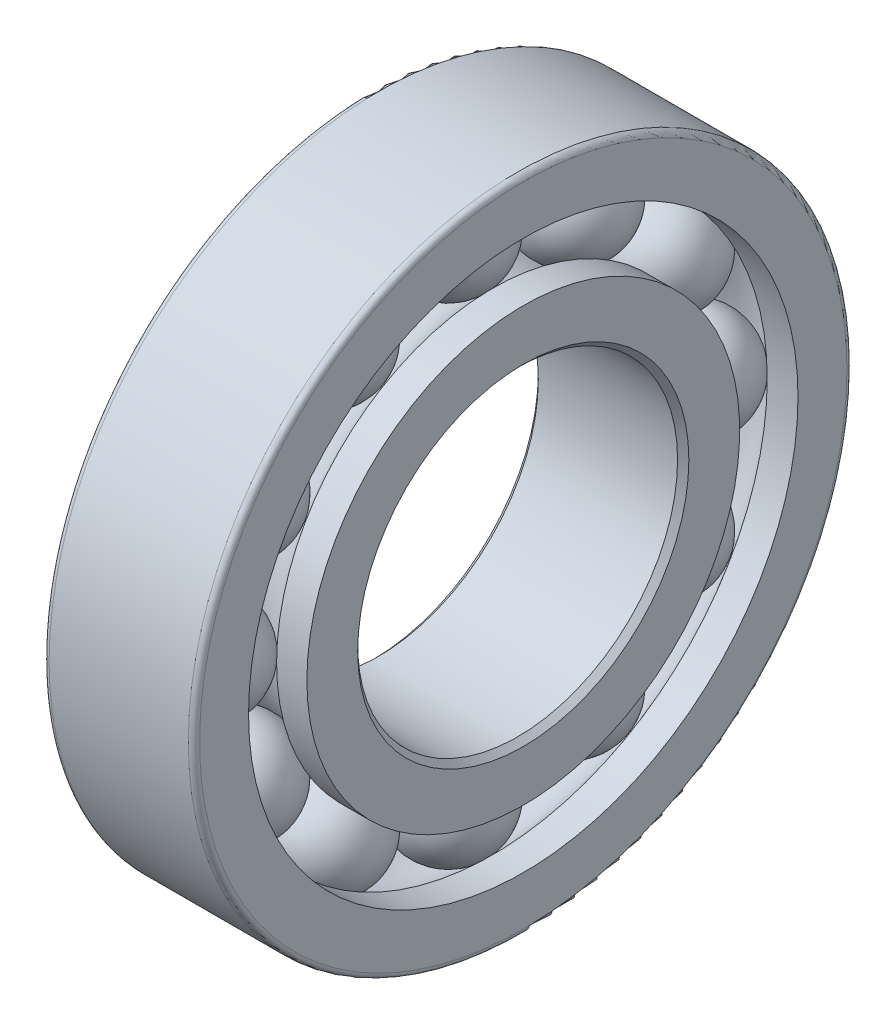
ISO-10303-21;
HEADER;
FILE_DESCRIPTION(('STEP AP214'),'2;1');
FILE_NAME('part.step','',(''),(''),'','','');
FILE_SCHEMA(('AUTOMOTIVE_DESIGN { 1 0 10303 214 1 1 1 1 }'));
ENDSEC;
DATA;
#1=APPLICATION_CONTEXT('core data for automotive mechanical design processes');
#2=APPLICATION_PROTOCOL_DEFINITION('international standard','automotive_design',2000,#1);
#3=PRODUCT_CONTEXT('',#1,'mechanical');
#4=PRODUCT('Part','Part','',(#3));
#5=PRODUCT_RELATED_PRODUCT_CATEGORY('part','',(#4));
#6=PRODUCT_DEFINITION_FORMATION('','',#4);
#7=PRODUCT_DEFINITION_CONTEXT('part definition',#1,'design');
#8=PRODUCT_DEFINITION('design','',#6,#7);
#9=PRODUCT_DEFINITION_SHAPE('','',#8);
#10=(LENGTH_UNIT() NAMED_UNIT(*) SI_UNIT(.MILLI.,.METRE.));
#11=(NAMED_UNIT(*) PLANE_ANGLE_UNIT() SI_UNIT($,.RADIAN.));
#12=(NAMED_UNIT(*) SI_UNIT($,.STERADIAN.) SOLID_ANGLE_UNIT());
#13=UNCERTAINTY_MEASURE_WITH_UNIT(LENGTH_MEASURE(1.E-05),#10,'distance_accuracy_value','');
#14=(GEOMETRIC_REPRESENTATION_CONTEXT(3) GLOBAL_UNCERTAINTY_ASSIGNED_CONTEXT((#13)) GLOBAL_UNIT_ASSIGNED_CONTEXT((#10,
#11,#12)) REPRESENTATION_CONTEXT('',''));
#15=CARTESIAN_POINT('',(0.,0.,0.));
#16=DIRECTION('',(0.,0.,1.));
#17=DIRECTION('',(1.,0.,0.));
#18=AXIS2_PLACEMENT_3D('',#15,#16,#17);
#19=CARTESIAN_POINT('',(0.,11.2843110113113,6.51499999999985));
#20=DIRECTION('',(1.,0.,0.));
#21=DIRECTION('',(0.,-0.866025403784445,-0.499999999999989));
#22=AXIS2_PLACEMENT_3D('',#19,#20,#21);
#23=SPHERICAL_SURFACE('',#22,2.8);
#24=CARTESIAN_POINT('',(2.8,11.2843110113113,6.51499999999985));
#25=VERTEX_POINT('',#24);
#26=VERTEX_LOOP('',#25);
#27=FACE_BOUND('',#26,.T.);
#28=ADVANCED_FACE('F37',(#27),#23,.T.);
#29=CLOSED_SHELL('',(#28));
#30=MANIFOLD_SOLID_BREP('B2',#29);
#31=CARTESIAN_POINT('',(0.,6.51500000000013,11.2843110113112));
#32=DIRECTION('',(1.,0.,0.));
#33=DIRECTION('',(0.,-0.50000000000001,-0.866025403784433));
#34=AXIS2_PLACEMENT_3D('',#31,#32,#33);
#35=SPHERICAL_SURFACE('',#34,2.8);
#36=CARTESIAN_POINT('',(2.8,6.51500000000013,11.2843110113112));
#37=VERTEX_POINT('',#36);
#38=VERTEX_LOOP('',#37);
#39=FACE_BOUND('',#38,.T.);
#40=ADVANCED_FACE('F55',(#39),#35,.T.);
#41=CLOSED_SHELL('',(#40));
#42=MANIFOLD_SOLID_BREP('B6',#41);
#43=CARTESIAN_POINT('',(0.,1.36482005535378E-13,13.03));
#44=DIRECTION('',(1.,0.,0.));
#45=DIRECTION('',(0.,0.,-1.));
#46=AXIS2_PLACEMENT_3D('',#43,#44,#45);
#47=SPHERICAL_SURFACE('',#46,2.8);
#48=CARTESIAN_POINT('',(2.8,1.36482005535378E-13,13.03));
#49=VERTEX_POINT('',#48);
#50=VERTEX_LOOP('',#49);
#51=FACE_BOUND('',#50,.T.);
#52=ADVANCED_FACE('F73',(#51),#47,.T.);
#53=CLOSED_SHELL('',(#52));
#54=MANIFOLD_SOLID_BREP('B33',#53);
#55=CARTESIAN_POINT('',(0.,-6.51499999999989,11.2843110113113));
#56=DIRECTION('',(1.,0.,0.));
#57=DIRECTION('',(0.,0.499999999999992,-0.866025403784443));
#58=AXIS2_PLACEMENT_3D('',#55,#56,#57);
#59=SPHERICAL_SURFACE('',#58,2.8);
#60=CARTESIAN_POINT('',(2.8,-6.51499999999989,11.2843110113113));
#61=VERTEX_POINT('',#60);
#62=VERTEX_LOOP('',#61);
#63=FACE_BOUND('',#62,.T.);
#64=ADVANCED_FACE('F91',(#63),#59,.T.);
#65=CLOSED_SHELL('',(#64));
#66=MANIFOLD_SOLID_BREP('B51',#65);
#67=CARTESIAN_POINT('',(0.,-11.2843110113112,6.51500000000009));
#68=DIRECTION('',(1.,0.,0.));
#69=DIRECTION('',(0.,0.866025403784435,-0.500000000000007));
#70=AXIS2_PLACEMENT_3D('',#67,#68,#69);
#71=SPHERICAL_SURFACE('',#70,2.8);
#72=CARTESIAN_POINT('',(2.8,-11.2843110113112,6.51500000000009));
#73=VERTEX_POINT('',#72);
#74=VERTEX_LOOP('',#73);
#75=FACE_BOUND('',#74,.T.);
#76=ADVANCED_FACE('F109',(#75),#71,.T.);
#77=CLOSED_SHELL('',(#76));
#78=MANIFOLD_SOLID_BREP('B69',#77);
#79=CARTESIAN_POINT('',(0.,-13.03,0.));
#80=DIRECTION('',(1.,0.,0.));
#81=DIRECTION('',(0.,1.,0.));
#82=AXIS2_PLACEMENT_3D('',#79,#80,#81);
#83=SPHERICAL_SURFACE('',#82,2.8);
#84=CARTESIAN_POINT('',(2.8,-13.03,0.));
#85=VERTEX_POINT('',#84);
#86=VERTEX_LOOP('',#85);
#87=FACE_BOUND('',#86,.T.);
#88=ADVANCED_FACE('F127',(#87),#83,.T.);
#89=CLOSED_SHELL('',(#88));
#90=MANIFOLD_SOLID_BREP('B87',#89);
#91=CARTESIAN_POINT('',(0.,-11.2843110113113,-6.51499999999993));
#92=DIRECTION('',(1.,0.,0.));
#93=DIRECTION('',(0.,0.866025403784442,0.499999999999995));
#94=AXIS2_PLACEMENT_3D('',#91,#92,#93);
#95=SPHERICAL_SURFACE('',#94,2.8);
#96=CARTESIAN_POINT('',(2.8,-11.2843110113113,-6.51499999999993));
#97=VERTEX_POINT('',#96);
#98=VERTEX_LOOP('',#97);
#99=FACE_BOUND('',#98,.T.);
#100=ADVANCED_FACE('F145',(#99),#95,.T.);
#101=CLOSED_SHELL('',(#100));
#102=MANIFOLD_SOLID_BREP('B105',#101);
#103=CARTESIAN_POINT('',(0.,-6.51500000000005,-11.2843110113112));
#104=DIRECTION('',(1.,0.,0.));
#105=DIRECTION('',(0.,0.500000000000004,0.866025403784436));
#106=AXIS2_PLACEMENT_3D('',#103,#104,#105);
#107=SPHERICAL_SURFACE('',#106,2.8);
#108=CARTESIAN_POINT('',(2.8,-6.51500000000005,-11.2843110113112));
#109=VERTEX_POINT('',#108);
#110=VERTEX_LOOP('',#109);
#111=FACE_BOUND('',#110,.T.);
#112=ADVANCED_FACE('F163',(#111),#107,.T.);
#113=CLOSED_SHELL('',(#112));
#114=MANIFOLD_SOLID_BREP('B123',#113);
#115=CARTESIAN_POINT('',(0.,0.,-13.03));
#116=DIRECTION('',(1.,0.,0.));
#117=DIRECTION('',(0.,0.,1.));
#118=AXIS2_PLACEMENT_3D('',#115,#116,#117);
#119=SPHERICAL_SURFACE('',#118,2.8);
#120=CARTESIAN_POINT('',(2.8,0.,-13.03));
#121=VERTEX_POINT('',#120);
#122=VERTEX_LOOP('',#121);
#123=FACE_BOUND('',#122,.T.);
#124=ADVANCED_FACE('F181',(#123),#119,.T.);
#125=CLOSED_SHELL('',(#124));
#126=MANIFOLD_SOLID_BREP('B141',#125);
#127=CARTESIAN_POINT('',(0.,6.51499999999997,-11.2843110113113));
#128=DIRECTION('',(1.,0.,0.));
#129=DIRECTION('',(0.,-0.499999999999998,0.86602540378444));
#130=AXIS2_PLACEMENT_3D('',#127,#128,#129);
#131=SPHERICAL_SURFACE('',#130,2.8);
#132=CARTESIAN_POINT('',(2.8,6.51499999999997,-11.2843110113113));
#133=VERTEX_POINT('',#132);
#134=VERTEX_LOOP('',#133);
#135=FACE_BOUND('',#134,.T.);
#136=ADVANCED_FACE('F199',(#135),#131,.T.);
#137=CLOSED_SHELL('',(#136));
#138=MANIFOLD_SOLID_BREP('B159',#137);
#139=CARTESIAN_POINT('',(0.,11.2843110113112,-6.51500000000001));
#140=DIRECTION('',(1.,0.,0.));
#141=DIRECTION('',(0.,-0.866025403784438,0.500000000000001));
#142=AXIS2_PLACEMENT_3D('',#139,#140,#141);
#143=SPHERICAL_SURFACE('',#142,2.8);
#144=CARTESIAN_POINT('',(2.8,11.2843110113112,-6.51500000000001));
#145=VERTEX_POINT('',#144);
#146=VERTEX_LOOP('',#145);
#147=FACE_BOUND('',#146,.T.);
#148=ADVANCED_FACE('F217',(#147),#143,.T.);
#149=CLOSED_SHELL('',(#148));
#150=MANIFOLD_SOLID_BREP('B177',#149);
#151=CARTESIAN_POINT('',(0.,13.03,0.));
#152=DIRECTION('',(1.,0.,0.));
#153=DIRECTION('',(0.,-1.,0.));
#154=AXIS2_PLACEMENT_3D('',#151,#152,#153);
#155=SPHERICAL_SURFACE('',#154,2.8);
#156=CARTESIAN_POINT('',(2.8,13.03,0.));
#157=VERTEX_POINT('',#156);
#158=VERTEX_LOOP('',#157);
#159=FACE_BOUND('',#158,.T.);
#160=ADVANCED_FACE('F237',(#159),#155,.T.);
#161=CLOSED_SHELL('',(#160));
#162=MANIFOLD_SOLID_BREP('B195',#161);
#163=CARTESIAN_POINT('',(0.,0.,0.));
#164=DIRECTION('',(-1.,0.,0.));
#165=DIRECTION('',(0.,0.,1.));
#166=AXIS2_PLACEMENT_3D('',#163,#164,#165);
#167=TOROIDAL_SURFACE('',#166,13.031136982827,2.83814199822954);
#168=CARTESIAN_POINT('',(-2.36510440265568,0.,0.));
#169=DIRECTION('',(-1.,0.,0.));
#170=DIRECTION('',(0.,0.,1.));
#171=AXIS2_PLACEMENT_3D('',#168,#169,#170);
#172=CIRCLE('',#171,14.6);
#173=CARTESIAN_POINT('',(-2.36510440265568,0.,14.6));
#174=VERTEX_POINT('',#173);
#175=EDGE_CURVE('E285',#174,#174,#172,.T.);
#176=ORIENTED_EDGE('',*,*,#175,.T.);
#177=EDGE_LOOP('',(#176));
#178=FACE_BOUND('',#177,.T.);
#179=CARTESIAN_POINT('',(2.36510440265568,0.,0.));
#180=DIRECTION('',(-1.,0.,0.));
#181=DIRECTION('',(0.,0.,1.));
#182=AXIS2_PLACEMENT_3D('',#179,#180,#181);
#183=CIRCLE('',#182,14.6);
#184=CARTESIAN_POINT('',(2.36510440265568,0.,14.6));
#185=VERTEX_POINT('',#184);
#186=EDGE_CURVE('E276',#185,#185,#183,.T.);
#187=ORIENTED_EDGE('',*,*,#186,.F.);
#188=EDGE_LOOP('',(#187));
#189=FACE_BOUND('',#188,.T.);
#190=ADVANCED_FACE('F256',(#178,#189),#167,.F.);
#191=CARTESIAN_POINT('',(-25.3067290704054,0.,0.));
#192=DIRECTION('',(-1.,0.,0.));
#193=DIRECTION('',(0.,0.,1.));
#194=AXIS2_PLACEMENT_3D('',#191,#192,#193);
#195=CYLINDRICAL_SURFACE('',#194,14.6);
#196=ORIENTED_EDGE('',*,*,#186,.T.);
#197=EDGE_LOOP('',(#196));
#198=FACE_BOUND('',#197,.T.);
#199=CARTESIAN_POINT('',(4.,0.,0.));
#200=DIRECTION('',(-1.,0.,0.));
#201=DIRECTION('',(0.,0.,1.));
#202=AXIS2_PLACEMENT_3D('',#199,#200,#201);
#203=CIRCLE('',#202,14.6);
#204=CARTESIAN_POINT('',(4.,0.,14.6));
#205=VERTEX_POINT('',#204);
#206=EDGE_CURVE('E279',#205,#205,#203,.T.);
#207=ORIENTED_EDGE('',*,*,#206,.F.);
#208=EDGE_LOOP('',(#207));
#209=FACE_BOUND('',#208,.T.);
#210=ADVANCED_FACE('F297',(#198,#209),#195,.F.);
#211=CARTESIAN_POINT('',(4.,0.,0.));
#212=DIRECTION('',(1.,0.,0.));
#213=DIRECTION('',(0.,0.,-1.));
#214=AXIS2_PLACEMENT_3D('',#211,#212,#213);
#215=PLANE('',#214);
#216=CARTESIAN_POINT('',(4.,0.,0.));
#217=DIRECTION('',(1.,0.,0.));
#218=DIRECTION('',(0.,0.,-1.));
#219=AXIS2_PLACEMENT_3D('',#216,#217,#218);
#220=CIRCLE('',#219,17.2);
#221=CARTESIAN_POINT('',(4.,0.,-17.2));
#222=VERTEX_POINT('',#221);
#223=EDGE_CURVE('E263',#222,#222,#220,.T.);
#224=ORIENTED_EDGE('',*,*,#223,.T.);
#225=EDGE_LOOP('',(#224));
#226=FACE_BOUND('',#225,.T.);
#227=ORIENTED_EDGE('',*,*,#206,.T.);
#228=EDGE_LOOP('',(#227));
#229=FACE_BOUND('',#228,.T.);
#230=ADVANCED_FACE('F306',(#226,#229),#215,.T.);
#231=CARTESIAN_POINT('',(-25.3067290704054,0.,0.));
#232=DIRECTION('',(-1.,0.,0.));
#233=DIRECTION('',(0.,0.,1.));
#234=AXIS2_PLACEMENT_3D('',#231,#232,#233);
#235=CYLINDRICAL_SURFACE('',#234,17.5);
#236=CARTESIAN_POINT('',(3.69999999999999,0.,0.));
#237=DIRECTION('',(1.,0.,0.));
#238=DIRECTION('',(0.,0.,-1.));
#239=AXIS2_PLACEMENT_3D('',#236,#237,#238);
#240=CIRCLE('',#239,17.5);
#241=CARTESIAN_POINT('',(3.69999999999999,0.,-17.5));
#242=VERTEX_POINT('',#241);
#243=EDGE_CURVE('E267',#242,#242,#240,.F.);
#244=ORIENTED_EDGE('',*,*,#243,.T.);
#245=EDGE_LOOP('',(#244));
#246=FACE_BOUND('',#245,.T.);
#247=CARTESIAN_POINT('',(-3.7,0.,0.));
#248=DIRECTION('',(1.,0.,0.));
#249=DIRECTION('',(0.,0.,-1.));
#250=AXIS2_PLACEMENT_3D('',#247,#248,#249);
#251=CIRCLE('',#250,17.5);
#252=CARTESIAN_POINT('',(-3.7,0.,-17.5));
#253=VERTEX_POINT('',#252);
#254=EDGE_CURVE('E271',#253,#253,#251,.T.);
#255=ORIENTED_EDGE('',*,*,#254,.T.);
#256=EDGE_LOOP('',(#255));
#257=FACE_BOUND('',#256,.T.);
#258=ADVANCED_FACE('F303',(#246,#257),#235,.T.);
#259=CARTESIAN_POINT('',(-4.,0.,0.));
#260=DIRECTION('',(1.,0.,0.));
#261=DIRECTION('',(0.,0.,-1.));
#262=AXIS2_PLACEMENT_3D('',#259,#260,#261);
#263=PLANE('',#262);
#264=CARTESIAN_POINT('',(-4.,0.,0.));
#265=DIRECTION('',(1.,0.,0.));
#266=DIRECTION('',(0.,0.,-1.));
#267=AXIS2_PLACEMENT_3D('',#264,#265,#266);
#268=CIRCLE('',#267,17.2);
#269=CARTESIAN_POINT('',(-4.,0.,-17.2));
#270=VERTEX_POINT('',#269);
#271=EDGE_CURVE('E236',#270,#270,#268,.F.);
#272=ORIENTED_EDGE('',*,*,#271,.T.);
#273=EDGE_LOOP('',(#272));
#274=FACE_BOUND('',#273,.T.);
#275=CARTESIAN_POINT('',(-4.,0.,0.));
#276=DIRECTION('',(-1.,0.,0.));
#277=DIRECTION('',(0.,0.,1.));
#278=AXIS2_PLACEMENT_3D('',#275,#276,#277);
#279=CIRCLE('',#278,14.6);
#280=CARTESIAN_POINT('',(-4.,0.,14.6));
#281=VERTEX_POINT('',#280);
#282=EDGE_CURVE('E282',#281,#281,#279,.T.);
#283=ORIENTED_EDGE('',*,*,#282,.F.);
#284=EDGE_LOOP('',(#283));
#285=FACE_BOUND('',#284,.T.);
#286=ADVANCED_FACE('F294',(#274,#285),#263,.F.);
#287=ORIENTED_EDGE('',*,*,#282,.T.);
#288=EDGE_LOOP('',(#287));
#289=FACE_BOUND('',#288,.T.);
#290=ORIENTED_EDGE('',*,*,#175,.F.);
#291=EDGE_LOOP('',(#290));
#292=FACE_BOUND('',#291,.T.);
#293=ADVANCED_FACE('F291',(#289,#292),#195,.F.);
#294=CARTESIAN_POINT('',(3.69999999999999,0.,0.));
#295=DIRECTION('',(1.,0.,0.));
#296=DIRECTION('',(0.,0.,-1.));
#297=AXIS2_PLACEMENT_3D('',#294,#295,#296);
#298=TOROIDAL_SURFACE('',#297,17.2,0.3);
#299=ORIENTED_EDGE('',*,*,#223,.F.);
#300=EDGE_LOOP('',(#299));
#301=FACE_BOUND('',#300,.T.);
#302=ORIENTED_EDGE('',*,*,#243,.F.);
#303=EDGE_LOOP('',(#302));
#304=FACE_BOUND('',#303,.T.);
#305=ADVANCED_FACE('F293',(#301,#304),#298,.T.);
#306=CARTESIAN_POINT('',(-3.7,0.,0.));
#307=DIRECTION('',(1.,0.,0.));
#308=DIRECTION('',(0.,0.,-1.));
#309=AXIS2_PLACEMENT_3D('',#306,#307,#308);
#310=TOROIDAL_SURFACE('',#309,17.2,0.3);
#311=ORIENTED_EDGE('',*,*,#254,.F.);
#312=EDGE_LOOP('',(#311));
#313=FACE_BOUND('',#312,.T.);
#314=ORIENTED_EDGE('',*,*,#271,.F.);
#315=EDGE_LOOP('',(#314));
#316=FACE_BOUND('',#315,.T.);
#317=ADVANCED_FACE('F258',(#313,#316),#310,.T.);
#318=CLOSED_SHELL('',(#190,#210,#230,#258,#286,#293,#305,#317));
#319=MANIFOLD_SOLID_BREP('B213',#318);
#320=CARTESIAN_POINT('',(0.,0.,0.));
#321=DIRECTION('',(-1.,0.,0.));
#322=DIRECTION('',(0.,0.,1.));
#323=AXIS2_PLACEMENT_3D('',#320,#321,#322);
#324=TOROIDAL_SURFACE('',#323,13.031136982827,2.83814199822954);
#325=CARTESIAN_POINT('',(2.38970072225242,0.,0.));
#326=DIRECTION('',(-1.,0.,0.));
#327=DIRECTION('',(0.,0.,1.));
#328=AXIS2_PLACEMENT_3D('',#325,#326,#327);
#329=CIRCLE('',#328,11.5);
#330=CARTESIAN_POINT('',(2.38970072225242,0.,11.5));
#331=VERTEX_POINT('',#330);
#332=EDGE_CURVE('E405',#331,#331,#329,.T.);
#333=ORIENTED_EDGE('',*,*,#332,.T.);
#334=EDGE_LOOP('',(#333));
#335=FACE_BOUND('',#334,.T.);
#336=CARTESIAN_POINT('',(-2.38970072225242,0.,0.));
#337=DIRECTION('',(-1.,0.,0.));
#338=DIRECTION('',(0.,0.,1.));
#339=AXIS2_PLACEMENT_3D('',#336,#337,#338);
#340=CIRCLE('',#339,11.5);
#341=CARTESIAN_POINT('',(-2.38970072225242,0.,11.5));
#342=VERTEX_POINT('',#341);
#343=EDGE_CURVE('E396',#342,#342,#340,.T.);
#344=ORIENTED_EDGE('',*,*,#343,.F.);
#345=EDGE_LOOP('',(#344));
#346=FACE_BOUND('',#345,.T.);
#347=ADVANCED_FACE('F376',(#335,#346),#324,.F.);
#348=CARTESIAN_POINT('',(-25.3067290704054,0.,0.));
#349=DIRECTION('',(-1.,0.,0.));
#350=DIRECTION('',(0.,0.,1.));
#351=AXIS2_PLACEMENT_3D('',#348,#349,#350);
#352=CYLINDRICAL_SURFACE('',#351,11.5);
#353=CARTESIAN_POINT('',(-4.,0.,0.));
#354=DIRECTION('',(-1.,0.,0.));
#355=DIRECTION('',(0.,0.,1.));
#356=AXIS2_PLACEMENT_3D('',#353,#354,#355);
#357=CIRCLE('',#356,11.5);
#358=CARTESIAN_POINT('',(-4.,0.,11.5));
#359=VERTEX_POINT('',#358);
#360=EDGE_CURVE('E399',#359,#359,#357,.T.);
#361=ORIENTED_EDGE('',*,*,#360,.F.);
#362=EDGE_LOOP('',(#361));
#363=FACE_BOUND('',#362,.T.);
#364=ORIENTED_EDGE('',*,*,#343,.T.);
#365=EDGE_LOOP('',(#364));
#366=FACE_BOUND('',#365,.T.);
#367=ADVANCED_FACE('F417',(#363,#366),#352,.T.);
#368=CARTESIAN_POINT('',(-4.,0.,0.));
#369=DIRECTION('',(1.,0.,0.));
#370=DIRECTION('',(0.,0.,-1.));
#371=AXIS2_PLACEMENT_3D('',#368,#369,#370);
#372=PLANE('',#371);
#373=CARTESIAN_POINT('',(-4.,0.,0.));
#374=DIRECTION('',(1.,0.,0.));
#375=DIRECTION('',(0.,0.,-1.));
#376=AXIS2_PLACEMENT_3D('',#373,#374,#375);
#377=CIRCLE('',#376,8.8);
#378=CARTESIAN_POINT('',(-4.,0.,-8.8));
#379=VERTEX_POINT('',#378);
#380=EDGE_CURVE('E255',#379,#379,#377,.T.);
#381=ORIENTED_EDGE('',*,*,#380,.T.);
#382=EDGE_LOOP('',(#381));
#383=FACE_BOUND('',#382,.T.);
#384=ORIENTED_EDGE('',*,*,#360,.T.);
#385=EDGE_LOOP('',(#384));
#386=FACE_BOUND('',#385,.T.);
#387=ADVANCED_FACE('F427',(#383,#386),#372,.F.);
#388=CARTESIAN_POINT('',(-25.3067290704054,0.,0.));
#389=DIRECTION('',(-1.,0.,0.));
#390=DIRECTION('',(0.,0.,1.));
#391=AXIS2_PLACEMENT_3D('',#388,#389,#390);
#392=CYLINDRICAL_SURFACE('',#391,8.5);
#393=CARTESIAN_POINT('',(3.69999999999999,0.,0.));
#394=DIRECTION('',(1.,0.,0.));
#395=DIRECTION('',(0.,0.,-1.));
#396=AXIS2_PLACEMENT_3D('',#393,#394,#395);
#397=CIRCLE('',#396,8.5);
#398=CARTESIAN_POINT('',(3.69999999999999,0.,-8.5));
#399=VERTEX_POINT('',#398);
#400=EDGE_CURVE('E383',#399,#399,#397,.T.);
#401=ORIENTED_EDGE('',*,*,#400,.T.);
#402=EDGE_LOOP('',(#401));
#403=FACE_BOUND('',#402,.T.);
#404=CARTESIAN_POINT('',(-3.7,0.,0.));
#405=DIRECTION('',(1.,0.,0.));
#406=DIRECTION('',(0.,0.,-1.));
#407=AXIS2_PLACEMENT_3D('',#404,#405,#406);
#408=CIRCLE('',#407,8.5);
#409=CARTESIAN_POINT('',(-3.7,0.,-8.5));
#410=VERTEX_POINT('',#409);
#411=EDGE_CURVE('E387',#410,#410,#408,.F.);
#412=ORIENTED_EDGE('',*,*,#411,.T.);
#413=EDGE_LOOP('',(#412));
#414=FACE_BOUND('',#413,.T.);
#415=ADVANCED_FACE('F421',(#403,#414),#392,.F.);
#416=CARTESIAN_POINT('',(4.,0.,0.));
#417=DIRECTION('',(1.,0.,0.));
#418=DIRECTION('',(0.,0.,-1.));
#419=AXIS2_PLACEMENT_3D('',#416,#417,#418);
#420=PLANE('',#419);
#421=CARTESIAN_POINT('',(4.,0.,0.));
#422=DIRECTION('',(1.,0.,0.));
#423=DIRECTION('',(0.,0.,-1.));
#424=AXIS2_PLACEMENT_3D('',#421,#422,#423);
#425=CIRCLE('',#424,8.8);
#426=CARTESIAN_POINT('',(4.,0.,-8.8));
#427=VERTEX_POINT('',#426);
#428=EDGE_CURVE('E391',#427,#427,#425,.F.);
#429=ORIENTED_EDGE('',*,*,#428,.T.);
#430=EDGE_LOOP('',(#429));
#431=FACE_BOUND('',#430,.T.);
#432=CARTESIAN_POINT('',(4.,0.,0.));
#433=DIRECTION('',(-1.,0.,0.));
#434=DIRECTION('',(0.,0.,1.));
#435=AXIS2_PLACEMENT_3D('',#432,#433,#434);
#436=CIRCLE('',#435,11.5);
#437=CARTESIAN_POINT('',(4.,0.,11.5));
#438=VERTEX_POINT('',#437);
#439=EDGE_CURVE('E402',#438,#438,#436,.T.);
#440=ORIENTED_EDGE('',*,*,#439,.F.);
#441=EDGE_LOOP('',(#440));
#442=FACE_BOUND('',#441,.T.);
#443=ADVANCED_FACE('F415',(#431,#442),#420,.T.);
#444=ORIENTED_EDGE('',*,*,#332,.F.);
#445=EDGE_LOOP('',(#444));
#446=FACE_BOUND('',#445,.T.);
#447=ORIENTED_EDGE('',*,*,#439,.T.);
#448=EDGE_LOOP('',(#447));
#449=FACE_BOUND('',#448,.T.);
#450=ADVANCED_FACE('F411',(#446,#449),#352,.T.);
#451=CARTESIAN_POINT('',(4.,0.,0.));
#452=DIRECTION('',(1.,0.,0.));
#453=DIRECTION('',(0.,0.,-1.));
#454=AXIS2_PLACEMENT_3D('',#451,#452,#453);
#455=CONICAL_SURFACE('',#454,8.8,0.785398163397443);
#456=ORIENTED_EDGE('',*,*,#400,.F.);
#457=EDGE_LOOP('',(#456));
#458=FACE_BOUND('',#457,.T.);
#459=ORIENTED_EDGE('',*,*,#428,.F.);
#460=EDGE_LOOP('',(#459));
#461=FACE_BOUND('',#460,.T.);
#462=ADVANCED_FACE('F414',(#458,#461),#455,.F.);
#463=CARTESIAN_POINT('',(-3.7,0.,0.));
#464=DIRECTION('',(-1.,0.,0.));
#465=DIRECTION('',(0.,0.,1.));
#466=AXIS2_PLACEMENT_3D('',#463,#464,#465);
#467=CONICAL_SURFACE('',#466,8.5,0.785398163397448);
#468=ORIENTED_EDGE('',*,*,#380,.F.);
#469=EDGE_LOOP('',(#468));
#470=FACE_BOUND('',#469,.T.);
#471=ORIENTED_EDGE('',*,*,#411,.F.);
#472=EDGE_LOOP('',(#471));
#473=FACE_BOUND('',#472,.T.);
#474=ADVANCED_FACE('F378',(#470,#473),#467,.F.);
#475=CLOSED_SHELL('',(#347,#367,#387,#415,#443,#450,#462,#474));
#476=MANIFOLD_SOLID_BREP('B231',#475);
#477=ADVANCED_BREP_SHAPE_REPRESENTATION('',(#18,#30,#42,#54,#66,#78,#90,#102,#114,#126,#138,
#150,#162,#319,#476),#14);
#478=SHAPE_DEFINITION_REPRESENTATION(#9,#477);
ENDSEC;
END-ISO-10303-21;
